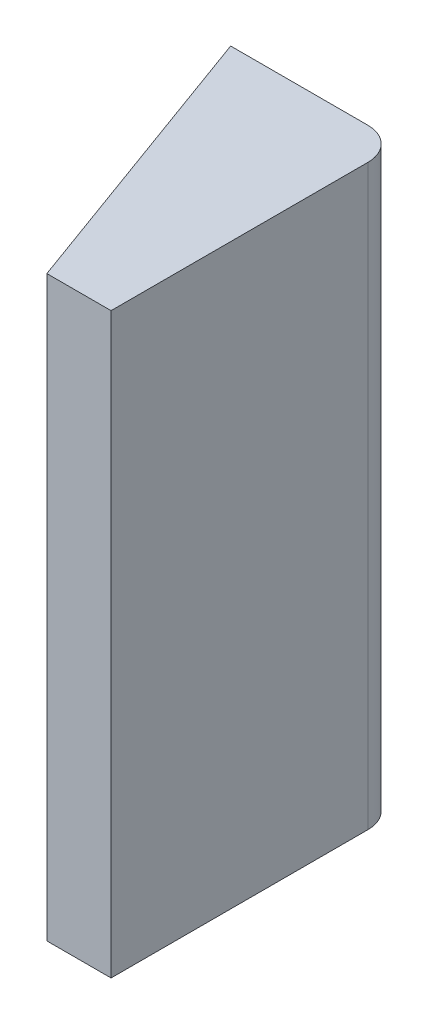
ISO-10303-21;
HEADER;
FILE_DESCRIPTION(('STEP AP214'),'2;1');
FILE_NAME('part.step','',(''),(''),'','','');
FILE_SCHEMA(('AUTOMOTIVE_DESIGN { 1 0 10303 214 1 1 1 1 }'));
ENDSEC;
DATA;
#1=APPLICATION_CONTEXT('core data for automotive mechanical design processes');
#2=APPLICATION_PROTOCOL_DEFINITION('international standard','automotive_design',2000,#1);
#3=PRODUCT_CONTEXT('',#1,'mechanical');
#4=PRODUCT('Part','Part','',(#3));
#5=PRODUCT_RELATED_PRODUCT_CATEGORY('part','',(#4));
#6=PRODUCT_DEFINITION_FORMATION('','',#4);
#7=PRODUCT_DEFINITION_CONTEXT('part definition',#1,'design');
#8=PRODUCT_DEFINITION('design','',#6,#7);
#9=PRODUCT_DEFINITION_SHAPE('','',#8);
#10=(LENGTH_UNIT() NAMED_UNIT(*) SI_UNIT(.MILLI.,.METRE.));
#11=(NAMED_UNIT(*) PLANE_ANGLE_UNIT() SI_UNIT($,.RADIAN.));
#12=(NAMED_UNIT(*) SI_UNIT($,.STERADIAN.) SOLID_ANGLE_UNIT());
#13=UNCERTAINTY_MEASURE_WITH_UNIT(LENGTH_MEASURE(1.E-05),#10,'distance_accuracy_value','');
#14=(GEOMETRIC_REPRESENTATION_CONTEXT(3) GLOBAL_UNCERTAINTY_ASSIGNED_CONTEXT((#13)) GLOBAL_UNIT_ASSIGNED_CONTEXT((#10,
#11,#12)) REPRESENTATION_CONTEXT('',''));
#15=CARTESIAN_POINT('',(0.,0.,0.));
#16=DIRECTION('',(0.,0.,1.));
#17=DIRECTION('',(1.,0.,0.));
#18=AXIS2_PLACEMENT_3D('',#15,#16,#17);
#19=CARTESIAN_POINT('',(0.,90.,0.));
#20=DIRECTION('',(0.,0.,1.));
#21=DIRECTION('',(1.,0.,0.));
#22=AXIS2_PLACEMENT_3D('',#19,#20,#21);
#23=PLANE('',#22);
#24=DIRECTION('',(-1.,0.,0.));
#25=VECTOR('',#24,1.);
#26=CARTESIAN_POINT('',(0.,90.,0.));
#27=LINE('',#26,#25);
#28=CARTESIAN_POINT('',(21.378660541979,90.,0.));
#29=VERTEX_POINT('',#28);
#30=CARTESIAN_POINT('',(0.,90.,0.));
#31=VERTEX_POINT('',#30);
#32=EDGE_CURVE('E87',#29,#31,#27,.T.);
#33=ORIENTED_EDGE('',*,*,#32,.F.);
#34=DIRECTION('',(0.,-1.,0.));
#35=VECTOR('',#34,1.);
#36=CARTESIAN_POINT('',(21.378660541979,90.,0.));
#37=LINE('',#36,#35);
#38=CARTESIAN_POINT('',(21.378660541979,0.,0.));
#39=VERTEX_POINT('',#38);
#40=EDGE_CURVE('E110',#29,#39,#37,.T.);
#41=ORIENTED_EDGE('',*,*,#40,.T.);
#42=DIRECTION('',(-1.,0.,0.));
#43=VECTOR('',#42,1.);
#44=CARTESIAN_POINT('',(0.,0.,0.));
#45=LINE('',#44,#43);
#46=CARTESIAN_POINT('',(0.,0.,0.));
#47=VERTEX_POINT('',#46);
#48=EDGE_CURVE('E108',#39,#47,#45,.T.);
#49=ORIENTED_EDGE('',*,*,#48,.T.);
#50=DIRECTION('',(0.,-1.,0.));
#51=VECTOR('',#50,1.);
#52=CARTESIAN_POINT('',(0.,90.,0.));
#53=LINE('',#52,#51);
#54=EDGE_CURVE('E102',#31,#47,#53,.T.);
#55=ORIENTED_EDGE('',*,*,#54,.F.);
#56=EDGE_LOOP('',(#33,#41,#49,#55));
#57=FACE_BOUND('',#56,.T.);
#58=ADVANCED_FACE('F41',(#57),#23,.F.);
#59=CARTESIAN_POINT('',(0.,90.,0.));
#60=DIRECTION('',(0.939692620785909,0.,-0.342020143325666));
#61=DIRECTION('',(-0.342020143325666,0.,-0.939692620785909));
#62=AXIS2_PLACEMENT_3D('',#59,#60,#61);
#63=PLANE('',#62);
#64=DIRECTION('',(0.342020143325666,0.,0.939692620785909));
#65=VECTOR('',#64,1.);
#66=CARTESIAN_POINT('',(0.,0.,0.));
#67=LINE('',#66,#65);
#68=CARTESIAN_POINT('',(16.378660541979,0.,45.));
#69=VERTEX_POINT('',#68);
#70=EDGE_CURVE('E123',#47,#69,#67,.T.);
#71=ORIENTED_EDGE('',*,*,#70,.T.);
#72=DIRECTION('',(0.,-1.,0.));
#73=VECTOR('',#72,1.);
#74=CARTESIAN_POINT('',(16.378660541979,90.,45.));
#75=LINE('',#74,#73);
#76=CARTESIAN_POINT('',(16.378660541979,90.,45.));
#77=VERTEX_POINT('',#76);
#78=EDGE_CURVE('E104',#77,#69,#75,.T.);
#79=ORIENTED_EDGE('',*,*,#78,.F.);
#80=DIRECTION('',(0.342020143325666,0.,0.939692620785909));
#81=VECTOR('',#80,1.);
#82=CARTESIAN_POINT('',(0.,90.,0.));
#83=LINE('',#82,#81);
#84=EDGE_CURVE('E90',#31,#77,#83,.T.);
#85=ORIENTED_EDGE('',*,*,#84,.F.);
#86=ORIENTED_EDGE('',*,*,#54,.T.);
#87=EDGE_LOOP('',(#71,#79,#85,#86));
#88=FACE_BOUND('',#87,.T.);
#89=ADVANCED_FACE('F101',(#88),#63,.F.);
#90=CARTESIAN_POINT('',(16.378660541979,90.,45.));
#91=DIRECTION('',(0.,0.,-1.));
#92=DIRECTION('',(-1.,0.,0.));
#93=AXIS2_PLACEMENT_3D('',#90,#91,#92);
#94=PLANE('',#93);
#95=DIRECTION('',(1.,0.,0.));
#96=VECTOR('',#95,1.);
#97=CARTESIAN_POINT('',(16.378660541979,0.,45.));
#98=LINE('',#97,#96);
#99=CARTESIAN_POINT('',(26.378660541979,0.,45.));
#100=VERTEX_POINT('',#99);
#101=EDGE_CURVE('E121',#69,#100,#98,.T.);
#102=ORIENTED_EDGE('',*,*,#101,.T.);
#103=DIRECTION('',(0.,-1.,0.));
#104=VECTOR('',#103,1.);
#105=CARTESIAN_POINT('',(26.378660541979,90.,45.));
#106=LINE('',#105,#104);
#107=CARTESIAN_POINT('',(26.378660541979,90.,45.));
#108=VERTEX_POINT('',#107);
#109=EDGE_CURVE('E113',#108,#100,#106,.T.);
#110=ORIENTED_EDGE('',*,*,#109,.F.);
#111=DIRECTION('',(1.,0.,0.));
#112=VECTOR('',#111,1.);
#113=CARTESIAN_POINT('',(16.378660541979,90.,45.));
#114=LINE('',#113,#112);
#115=EDGE_CURVE('E106',#77,#108,#114,.T.);
#116=ORIENTED_EDGE('',*,*,#115,.F.);
#117=ORIENTED_EDGE('',*,*,#78,.T.);
#118=EDGE_LOOP('',(#102,#110,#116,#117));
#119=FACE_BOUND('',#118,.T.);
#120=ADVANCED_FACE('F129',(#119),#94,.F.);
#121=CARTESIAN_POINT('',(26.378660541979,90.,0.));
#122=DIRECTION('',(-1.,0.,0.));
#123=DIRECTION('',(0.,0.,1.));
#124=AXIS2_PLACEMENT_3D('',#121,#122,#123);
#125=PLANE('',#124);
#126=DIRECTION('',(0.,0.,-1.));
#127=VECTOR('',#126,1.);
#128=CARTESIAN_POINT('',(26.378660541979,0.,0.));
#129=LINE('',#128,#127);
#130=CARTESIAN_POINT('',(26.378660541979,0.,5.));
#131=VERTEX_POINT('',#130);
#132=EDGE_CURVE('E97',#100,#131,#129,.T.);
#133=ORIENTED_EDGE('',*,*,#132,.T.);
#134=DIRECTION('',(0.,-1.,0.));
#135=VECTOR('',#134,1.);
#136=CARTESIAN_POINT('',(26.378660541979,90.,5.));
#137=LINE('',#136,#135);
#138=CARTESIAN_POINT('',(26.378660541979,90.,5.));
#139=VERTEX_POINT('',#138);
#140=EDGE_CURVE('E49',#131,#139,#137,.F.);
#141=ORIENTED_EDGE('',*,*,#140,.T.);
#142=DIRECTION('',(0.,0.,-1.));
#143=VECTOR('',#142,1.);
#144=CARTESIAN_POINT('',(26.378660541979,90.,0.));
#145=LINE('',#144,#143);
#146=EDGE_CURVE('E119',#108,#139,#145,.T.);
#147=ORIENTED_EDGE('',*,*,#146,.F.);
#148=ORIENTED_EDGE('',*,*,#109,.T.);
#149=EDGE_LOOP('',(#133,#141,#147,#148));
#150=FACE_BOUND('',#149,.T.);
#151=ADVANCED_FACE('F131',(#150),#125,.F.);
#152=CARTESIAN_POINT('',(0.,90.,0.));
#153=DIRECTION('',(0.,-1.,0.));
#154=DIRECTION('',(0.,0.,-1.));
#155=AXIS2_PLACEMENT_3D('',#152,#153,#154);
#156=PLANE('',#155);
#157=ORIENTED_EDGE('',*,*,#146,.T.);
#158=CARTESIAN_POINT('',(21.378660541979,90.,5.));
#159=DIRECTION('',(0.,-1.,0.));
#160=DIRECTION('',(0.,0.,-1.));
#161=AXIS2_PLACEMENT_3D('',#158,#159,#160);
#162=CIRCLE('',#161,5.);
#163=EDGE_CURVE('E11',#139,#29,#162,.F.);
#164=ORIENTED_EDGE('',*,*,#163,.T.);
#165=ORIENTED_EDGE('',*,*,#32,.T.);
#166=ORIENTED_EDGE('',*,*,#84,.T.);
#167=ORIENTED_EDGE('',*,*,#115,.T.);
#168=EDGE_LOOP('',(#157,#164,#165,#166,#167));
#169=FACE_BOUND('',#168,.T.);
#170=ADVANCED_FACE('F89',(#169),#156,.F.);
#171=CARTESIAN_POINT('',(0.,0.,0.));
#172=DIRECTION('',(0.,-1.,0.));
#173=DIRECTION('',(0.,0.,-1.));
#174=AXIS2_PLACEMENT_3D('',#171,#172,#173);
#175=PLANE('',#174);
#176=ORIENTED_EDGE('',*,*,#48,.F.);
#177=CARTESIAN_POINT('',(21.378660541979,0.,5.));
#178=DIRECTION('',(0.,-1.,0.));
#179=DIRECTION('',(0.,0.,-1.));
#180=AXIS2_PLACEMENT_3D('',#177,#178,#179);
#181=CIRCLE('',#180,5.);
#182=EDGE_CURVE('E63',#39,#131,#181,.T.);
#183=ORIENTED_EDGE('',*,*,#182,.T.);
#184=ORIENTED_EDGE('',*,*,#132,.F.);
#185=ORIENTED_EDGE('',*,*,#101,.F.);
#186=ORIENTED_EDGE('',*,*,#70,.F.);
#187=EDGE_LOOP('',(#176,#183,#184,#185,#186));
#188=FACE_BOUND('',#187,.T.);
#189=ADVANCED_FACE('F138',(#188),#175,.T.);
#190=CARTESIAN_POINT('',(21.378660541979,90.,5.));
#191=DIRECTION('',(0.,-1.,0.));
#192=DIRECTION('',(0.,0.,-1.));
#193=AXIS2_PLACEMENT_3D('',#190,#191,#192);
#194=CYLINDRICAL_SURFACE('',#193,5.);
#195=ORIENTED_EDGE('',*,*,#163,.F.);
#196=ORIENTED_EDGE('',*,*,#140,.F.);
#197=ORIENTED_EDGE('',*,*,#182,.F.);
#198=ORIENTED_EDGE('',*,*,#40,.F.);
#199=EDGE_LOOP('',(#195,#196,#197,#198));
#200=FACE_BOUND('',#199,.T.);
#201=ADVANCED_FACE('F43',(#200),#194,.T.);
#202=CLOSED_SHELL('',(#58,#89,#120,#151,#170,#189,#201));
#203=MANIFOLD_SOLID_BREP('B2',#202);
#204=ADVANCED_BREP_SHAPE_REPRESENTATION('',(#18,#203),#14);
#205=SHAPE_DEFINITION_REPRESENTATION(#9,#204);
ENDSEC;
END-ISO-10303-21;
